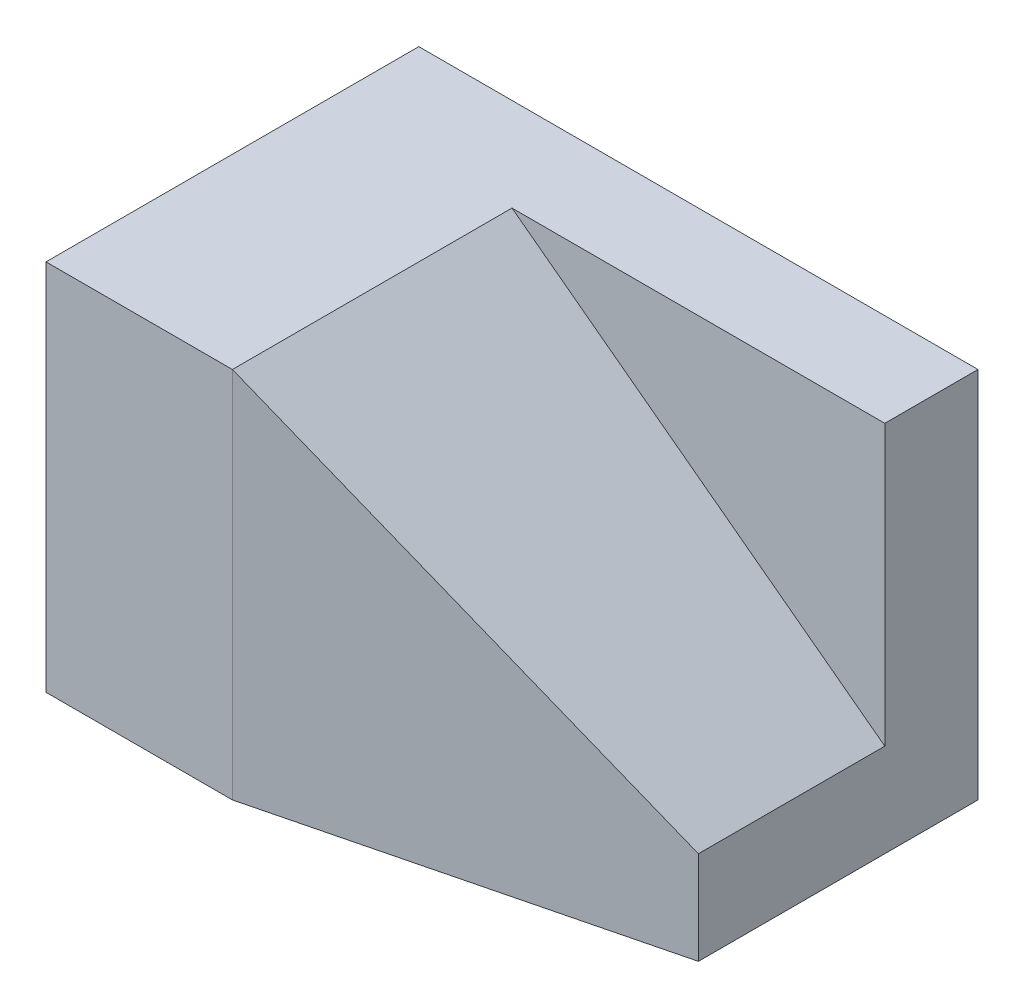
ISO-10303-21;
HEADER;
FILE_DESCRIPTION(('STEP AP214'),'2;1');
FILE_NAME('part.step','',(''),(''),'','','');
FILE_SCHEMA(('AUTOMOTIVE_DESIGN { 1 0 10303 214 1 1 1 1 }'));
ENDSEC;
DATA;
#1=APPLICATION_CONTEXT('core data for automotive mechanical design processes');
#2=APPLICATION_PROTOCOL_DEFINITION('international standard','automotive_design',2000,#1);
#3=PRODUCT_CONTEXT('',#1,'mechanical');
#4=PRODUCT('Part','Part','',(#3));
#5=PRODUCT_RELATED_PRODUCT_CATEGORY('part','',(#4));
#6=PRODUCT_DEFINITION_FORMATION('','',#4);
#7=PRODUCT_DEFINITION_CONTEXT('part definition',#1,'design');
#8=PRODUCT_DEFINITION('design','',#6,#7);
#9=PRODUCT_DEFINITION_SHAPE('','',#8);
#10=(LENGTH_UNIT() NAMED_UNIT(*) SI_UNIT(.MILLI.,.METRE.));
#11=(NAMED_UNIT(*) PLANE_ANGLE_UNIT() SI_UNIT($,.RADIAN.));
#12=(NAMED_UNIT(*) SI_UNIT($,.STERADIAN.) SOLID_ANGLE_UNIT());
#13=UNCERTAINTY_MEASURE_WITH_UNIT(LENGTH_MEASURE(1.E-05),#10,'distance_accuracy_value','');
#14=(GEOMETRIC_REPRESENTATION_CONTEXT(3) GLOBAL_UNCERTAINTY_ASSIGNED_CONTEXT((#13)) GLOBAL_UNIT_ASSIGNED_CONTEXT((#10,
#11,#12)) REPRESENTATION_CONTEXT('',''));
#15=CARTESIAN_POINT('',(0.,0.,0.));
#16=DIRECTION('',(0.,0.,1.));
#17=DIRECTION('',(1.,0.,0.));
#18=AXIS2_PLACEMENT_3D('',#15,#16,#17);
#19=CARTESIAN_POINT('',(0.,20.,-15.));
#20=DIRECTION('',(0.,0.,-1.));
#21=DIRECTION('',(-1.,0.,0.));
#22=AXIS2_PLACEMENT_3D('',#19,#20,#21);
#23=PLANE('',#22);
#24=DIRECTION('',(1.,0.,0.));
#25=VECTOR('',#24,1.);
#26=CARTESIAN_POINT('',(0.,20.,-15.));
#27=LINE('',#26,#25);
#28=CARTESIAN_POINT('',(10.,20.,-15.));
#29=VERTEX_POINT('',#28);
#30=CARTESIAN_POINT('',(30.,20.,-15.));
#31=VERTEX_POINT('',#30);
#32=EDGE_CURVE('E195',#29,#31,#27,.T.);
#33=ORIENTED_EDGE('',*,*,#32,.F.);
#34=DIRECTION('',(0.8,-0.6,0.));
#35=VECTOR('',#34,1.);
#36=CARTESIAN_POINT('',(10.,20.,-15.));
#37=LINE('',#36,#35);
#38=CARTESIAN_POINT('',(30.,5.,-15.));
#39=VERTEX_POINT('',#38);
#40=EDGE_CURVE('E61',#29,#39,#37,.T.);
#41=ORIENTED_EDGE('',*,*,#40,.T.);
#42=DIRECTION('',(0.,-1.,0.));
#43=VECTOR('',#42,1.);
#44=CARTESIAN_POINT('',(30.,20.,-15.));
#45=LINE('',#44,#43);
#46=EDGE_CURVE('E12',#31,#39,#45,.T.);
#47=ORIENTED_EDGE('',*,*,#46,.F.);
#48=EDGE_LOOP('',(#33,#41,#47));
#49=FACE_BOUND('',#48,.T.);
#50=ADVANCED_FACE('F43',(#49),#23,.F.);
#51=CARTESIAN_POINT('',(30.,20.,0.));
#52=DIRECTION('',(1.,0.,0.));
#53=DIRECTION('',(0.,0.,-1.));
#54=AXIS2_PLACEMENT_3D('',#51,#52,#53);
#55=PLANE('',#54);
#56=DIRECTION('',(0.,0.,1.));
#57=VECTOR('',#56,1.);
#58=CARTESIAN_POINT('',(30.,0.,0.));
#59=LINE('',#58,#57);
#60=CARTESIAN_POINT('',(30.,0.,-20.));
#61=VERTEX_POINT('',#60);
#62=CARTESIAN_POINT('',(30.,0.,-15.));
#63=VERTEX_POINT('',#62);
#64=EDGE_CURVE('E172',#61,#63,#59,.T.);
#65=ORIENTED_EDGE('',*,*,#64,.F.);
#66=DIRECTION('',(0.,-1.,0.));
#67=VECTOR('',#66,1.);
#68=CARTESIAN_POINT('',(30.,20.,-20.));
#69=LINE('',#68,#67);
#70=CARTESIAN_POINT('',(30.,20.,-20.));
#71=VERTEX_POINT('',#70);
#72=EDGE_CURVE('E52',#71,#61,#69,.T.);
#73=ORIENTED_EDGE('',*,*,#72,.F.);
#74=DIRECTION('',(0.,0.,1.));
#75=VECTOR('',#74,1.);
#76=CARTESIAN_POINT('',(30.,20.,0.));
#77=LINE('',#76,#75);
#78=EDGE_CURVE('E192',#71,#31,#77,.T.);
#79=ORIENTED_EDGE('',*,*,#78,.T.);
#80=ORIENTED_EDGE('',*,*,#46,.T.);
#81=DIRECTION('',(0.,0.,1.));
#82=VECTOR('',#81,1.);
#83=CARTESIAN_POINT('',(30.,5.,-4.99999999999999));
#84=LINE('',#83,#82);
#85=CARTESIAN_POINT('',(30.,5.,-4.99999999999999));
#86=VERTEX_POINT('',#85);
#87=EDGE_CURVE('E125',#39,#86,#84,.T.);
#88=ORIENTED_EDGE('',*,*,#87,.T.);
#89=DIRECTION('',(0.,-1.,0.));
#90=VECTOR('',#89,1.);
#91=CARTESIAN_POINT('',(30.,5.,-4.99999999999999));
#92=LINE('',#91,#90);
#93=CARTESIAN_POINT('',(30.,0.,-4.99999999999999));
#94=VERTEX_POINT('',#93);
#95=EDGE_CURVE('E111',#86,#94,#92,.T.);
#96=ORIENTED_EDGE('',*,*,#95,.T.);
#97=DIRECTION('',(0.,0.,-1.));
#98=VECTOR('',#97,1.);
#99=CARTESIAN_POINT('',(30.,0.,-4.99999999999999));
#100=LINE('',#99,#98);
#101=EDGE_CURVE('E124',#94,#63,#100,.T.);
#102=ORIENTED_EDGE('',*,*,#101,.T.);
#103=EDGE_LOOP('',(#65,#73,#79,#80,#88,#96,#102));
#104=FACE_BOUND('',#103,.T.);
#105=ADVANCED_FACE('F137',(#104),#55,.T.);
#106=CARTESIAN_POINT('',(0.,20.,-20.));
#107=DIRECTION('',(0.,0.,-1.));
#108=DIRECTION('',(-1.,0.,0.));
#109=AXIS2_PLACEMENT_3D('',#106,#107,#108);
#110=PLANE('',#109);
#111=DIRECTION('',(1.,0.,0.));
#112=VECTOR('',#111,1.);
#113=CARTESIAN_POINT('',(0.,0.,-20.));
#114=LINE('',#113,#112);
#115=CARTESIAN_POINT('',(0.,0.,-20.));
#116=VERTEX_POINT('',#115);
#117=EDGE_CURVE('E176',#116,#61,#114,.T.);
#118=ORIENTED_EDGE('',*,*,#117,.F.);
#119=DIRECTION('',(0.,-1.,0.));
#120=VECTOR('',#119,1.);
#121=CARTESIAN_POINT('',(0.,20.,-20.));
#122=LINE('',#121,#120);
#123=CARTESIAN_POINT('',(0.,20.,-20.));
#124=VERTEX_POINT('',#123);
#125=EDGE_CURVE('E87',#124,#116,#122,.T.);
#126=ORIENTED_EDGE('',*,*,#125,.F.);
#127=DIRECTION('',(1.,0.,0.));
#128=VECTOR('',#127,1.);
#129=CARTESIAN_POINT('',(0.,20.,-20.));
#130=LINE('',#129,#128);
#131=EDGE_CURVE('E201',#124,#71,#130,.T.);
#132=ORIENTED_EDGE('',*,*,#131,.T.);
#133=ORIENTED_EDGE('',*,*,#72,.T.);
#134=EDGE_LOOP('',(#118,#126,#132,#133));
#135=FACE_BOUND('',#134,.T.);
#136=ADVANCED_FACE('F157',(#135),#110,.T.);
#137=CARTESIAN_POINT('',(0.,20.,0.));
#138=DIRECTION('',(-1.,0.,0.));
#139=DIRECTION('',(0.,0.,1.));
#140=AXIS2_PLACEMENT_3D('',#137,#138,#139);
#141=PLANE('',#140);
#142=DIRECTION('',(0.,0.,-1.));
#143=VECTOR('',#142,1.);
#144=CARTESIAN_POINT('',(0.,0.,0.));
#145=LINE('',#144,#143);
#146=CARTESIAN_POINT('',(0.,0.,0.));
#147=VERTEX_POINT('',#146);
#148=EDGE_CURVE('E206',#147,#116,#145,.T.);
#149=ORIENTED_EDGE('',*,*,#148,.F.);
#150=DIRECTION('',(0.,-1.,0.));
#151=VECTOR('',#150,1.);
#152=CARTESIAN_POINT('',(0.,20.,0.));
#153=LINE('',#152,#151);
#154=CARTESIAN_POINT('',(0.,20.,0.));
#155=VERTEX_POINT('',#154);
#156=EDGE_CURVE('E80',#155,#147,#153,.T.);
#157=ORIENTED_EDGE('',*,*,#156,.F.);
#158=DIRECTION('',(0.,0.,-1.));
#159=VECTOR('',#158,1.);
#160=CARTESIAN_POINT('',(0.,20.,0.));
#161=LINE('',#160,#159);
#162=EDGE_CURVE('E198',#155,#124,#161,.T.);
#163=ORIENTED_EDGE('',*,*,#162,.T.);
#164=ORIENTED_EDGE('',*,*,#125,.T.);
#165=EDGE_LOOP('',(#149,#157,#163,#164));
#166=FACE_BOUND('',#165,.T.);
#167=ADVANCED_FACE('F232',(#166),#141,.T.);
#168=CARTESIAN_POINT('',(0.,20.,0.));
#169=DIRECTION('',(0.,0.,-1.));
#170=DIRECTION('',(-1.,0.,0.));
#171=AXIS2_PLACEMENT_3D('',#168,#169,#170);
#172=PLANE('',#171);
#173=DIRECTION('',(1.,0.,0.));
#174=VECTOR('',#173,1.);
#175=CARTESIAN_POINT('',(0.,0.,0.));
#176=LINE('',#175,#174);
#177=CARTESIAN_POINT('',(9.99999999999998,0.,0.));
#178=VERTEX_POINT('',#177);
#179=EDGE_CURVE('E74',#147,#178,#176,.T.);
#180=ORIENTED_EDGE('',*,*,#179,.T.);
#181=DIRECTION('',(0.,1.,0.));
#182=VECTOR('',#181,1.);
#183=CARTESIAN_POINT('',(10.,0.,0.));
#184=LINE('',#183,#182);
#185=CARTESIAN_POINT('',(10.,20.,0.));
#186=VERTEX_POINT('',#185);
#187=EDGE_CURVE('E197',#186,#178,#184,.F.);
#188=ORIENTED_EDGE('',*,*,#187,.F.);
#189=DIRECTION('',(1.,0.,0.));
#190=VECTOR('',#189,1.);
#191=CARTESIAN_POINT('',(0.,20.,0.));
#192=LINE('',#191,#190);
#193=EDGE_CURVE('E196',#155,#186,#192,.T.);
#194=ORIENTED_EDGE('',*,*,#193,.F.);
#195=ORIENTED_EDGE('',*,*,#156,.T.);
#196=EDGE_LOOP('',(#180,#188,#194,#195));
#197=FACE_BOUND('',#196,.T.);
#198=ADVANCED_FACE('F237',(#197),#172,.F.);
#199=CARTESIAN_POINT('',(0.,20.,0.));
#200=DIRECTION('',(0.,1.,0.));
#201=DIRECTION('',(0.,0.,1.));
#202=AXIS2_PLACEMENT_3D('',#199,#200,#201);
#203=PLANE('',#202);
#204=DIRECTION('',(0.,0.,1.));
#205=VECTOR('',#204,1.);
#206=CARTESIAN_POINT('',(10.,20.,0.));
#207=LINE('',#206,#205);
#208=EDGE_CURVE('E46',#186,#29,#207,.F.);
#209=ORIENTED_EDGE('',*,*,#208,.T.);
#210=ORIENTED_EDGE('',*,*,#32,.T.);
#211=ORIENTED_EDGE('',*,*,#78,.F.);
#212=ORIENTED_EDGE('',*,*,#131,.F.);
#213=ORIENTED_EDGE('',*,*,#162,.F.);
#214=ORIENTED_EDGE('',*,*,#193,.T.);
#215=EDGE_LOOP('',(#209,#210,#211,#212,#213,#214));
#216=FACE_BOUND('',#215,.T.);
#217=ADVANCED_FACE('F216',(#216),#203,.T.);
#218=CARTESIAN_POINT('',(0.,0.,0.));
#219=DIRECTION('',(0.,1.,0.));
#220=DIRECTION('',(0.,0.,1.));
#221=AXIS2_PLACEMENT_3D('',#218,#219,#220);
#222=PLANE('',#221);
#223=DIRECTION('',(0.970142500145332,0.,-0.242535625036333));
#224=VECTOR('',#223,1.);
#225=CARTESIAN_POINT('',(10.,0.,0.));
#226=LINE('',#225,#224);
#227=EDGE_CURVE('E118',#178,#94,#226,.T.);
#228=ORIENTED_EDGE('',*,*,#227,.F.);
#229=ORIENTED_EDGE('',*,*,#179,.F.);
#230=ORIENTED_EDGE('',*,*,#148,.T.);
#231=ORIENTED_EDGE('',*,*,#117,.T.);
#232=ORIENTED_EDGE('',*,*,#64,.T.);
#233=ORIENTED_EDGE('',*,*,#101,.F.);
#234=EDGE_LOOP('',(#228,#229,#230,#231,#232,#233));
#235=FACE_BOUND('',#234,.T.);
#236=ADVANCED_FACE('F248',(#235),#222,.F.);
#237=CARTESIAN_POINT('',(0.588235294117645,0.,2.35294117647058));
#238=DIRECTION('',(-0.242535625036333,0.,-0.970142500145332));
#239=DIRECTION('',(-0.970142500145332,0.,0.242535625036333));
#240=AXIS2_PLACEMENT_3D('',#237,#238,#239);
#241=PLANE('',#240);
#242=ORIENTED_EDGE('',*,*,#227,.T.);
#243=ORIENTED_EDGE('',*,*,#95,.F.);
#244=DIRECTION('',(0.784464540552736,-0.588348405414552,-0.196116135138184));
#245=VECTOR('',#244,1.);
#246=CARTESIAN_POINT('',(10.,20.,0.));
#247=LINE('',#246,#245);
#248=EDGE_CURVE('E115',#186,#86,#247,.T.);
#249=ORIENTED_EDGE('',*,*,#248,.F.);
#250=ORIENTED_EDGE('',*,*,#187,.T.);
#251=EDGE_LOOP('',(#242,#243,#249,#250));
#252=FACE_BOUND('',#251,.T.);
#253=ADVANCED_FACE('F114',(#252),#241,.F.);
#254=CARTESIAN_POINT('',(13.2,17.6,0.));
#255=DIRECTION('',(-0.6,-0.8,0.));
#256=DIRECTION('',(0.8,-0.6,0.));
#257=AXIS2_PLACEMENT_3D('',#254,#255,#256);
#258=PLANE('',#257);
#259=ORIENTED_EDGE('',*,*,#248,.T.);
#260=ORIENTED_EDGE('',*,*,#87,.F.);
#261=ORIENTED_EDGE('',*,*,#40,.F.);
#262=ORIENTED_EDGE('',*,*,#208,.F.);
#263=EDGE_LOOP('',(#259,#260,#261,#262));
#264=FACE_BOUND('',#263,.T.);
#265=ADVANCED_FACE('F131',(#264),#258,.F.);
#266=CLOSED_SHELL('',(#50,#105,#136,#167,#198,#217,#236,#253,#265));
#267=MANIFOLD_SOLID_BREP('B2',#266);
#268=ADVANCED_BREP_SHAPE_REPRESENTATION('',(#18,#267),#14);
#269=SHAPE_DEFINITION_REPRESENTATION(#9,#268);
ENDSEC;
END-ISO-10303-21;
